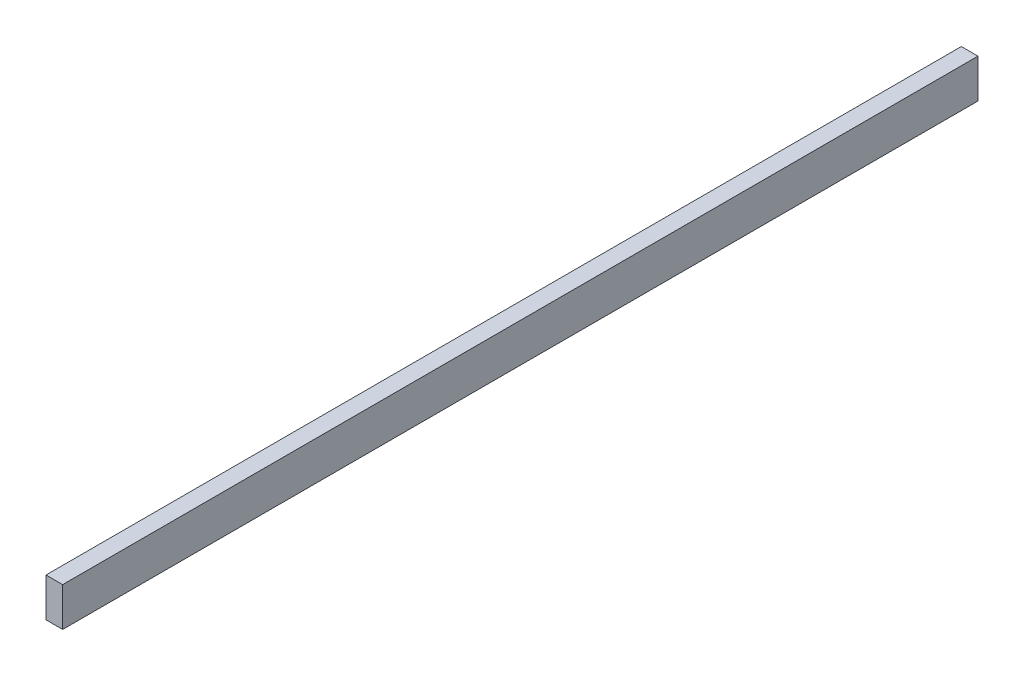
ISO-10303-21;
HEADER;
FILE_DESCRIPTION(('STEP AP214'),'2;1');
FILE_NAME('part.step','',(''),(''),'','','');
FILE_SCHEMA(('AUTOMOTIVE_DESIGN { 1 0 10303 214 1 1 1 1 }'));
ENDSEC;
DATA;
#1=APPLICATION_CONTEXT('core data for automotive mechanical design processes');
#2=APPLICATION_PROTOCOL_DEFINITION('international standard','automotive_design',2000,#1);
#3=PRODUCT_CONTEXT('',#1,'mechanical');
#4=PRODUCT('Part','Part','',(#3));
#5=PRODUCT_RELATED_PRODUCT_CATEGORY('part','',(#4));
#6=PRODUCT_DEFINITION_FORMATION('','',#4);
#7=PRODUCT_DEFINITION_CONTEXT('part definition',#1,'design');
#8=PRODUCT_DEFINITION('design','',#6,#7);
#9=PRODUCT_DEFINITION_SHAPE('','',#8);
#10=(LENGTH_UNIT() NAMED_UNIT(*) SI_UNIT(.MILLI.,.METRE.));
#11=(NAMED_UNIT(*) PLANE_ANGLE_UNIT() SI_UNIT($,.RADIAN.));
#12=(NAMED_UNIT(*) SI_UNIT($,.STERADIAN.) SOLID_ANGLE_UNIT());
#13=UNCERTAINTY_MEASURE_WITH_UNIT(LENGTH_MEASURE(1.E-05),#10,'distance_accuracy_value','');
#14=(GEOMETRIC_REPRESENTATION_CONTEXT(3) GLOBAL_UNCERTAINTY_ASSIGNED_CONTEXT((#13)) GLOBAL_UNIT_ASSIGNED_CONTEXT((#10,
#11,#12)) REPRESENTATION_CONTEXT('',''));
#15=CARTESIAN_POINT('',(0.,0.,0.));
#16=DIRECTION('',(0.,0.,1.));
#17=DIRECTION('',(1.,0.,0.));
#18=AXIS2_PLACEMENT_3D('',#15,#16,#17);
#19=CARTESIAN_POINT('',(0.,0.,2093.9125));
#20=DIRECTION('',(1.,0.,0.));
#21=DIRECTION('',(0.,0.,-1.));
#22=AXIS2_PLACEMENT_3D('',#19,#20,#21);
#23=PLANE('',#22);
#24=DIRECTION('',(0.,-1.,0.));
#25=VECTOR('',#24,1.);
#26=CARTESIAN_POINT('',(0.,0.,0.));
#27=LINE('',#26,#25);
#28=CARTESIAN_POINT('',(0.,88.9,0.));
#29=VERTEX_POINT('',#28);
#30=CARTESIAN_POINT('',(0.,0.,0.));
#31=VERTEX_POINT('',#30);
#32=EDGE_CURVE('E96',#29,#31,#27,.T.);
#33=ORIENTED_EDGE('',*,*,#32,.T.);
#34=DIRECTION('',(0.,0.,-1.));
#35=VECTOR('',#34,1.);
#36=CARTESIAN_POINT('',(0.,0.,2093.9125));
#37=LINE('',#36,#35);
#38=CARTESIAN_POINT('',(0.,0.,2093.9125));
#39=VERTEX_POINT('',#38);
#40=EDGE_CURVE('E11',#39,#31,#37,.T.);
#41=ORIENTED_EDGE('',*,*,#40,.F.);
#42=DIRECTION('',(0.,-1.,0.));
#43=VECTOR('',#42,1.);
#44=CARTESIAN_POINT('',(0.,0.,2093.9125));
#45=LINE('',#44,#43);
#46=CARTESIAN_POINT('',(0.,88.9,2093.9125));
#47=VERTEX_POINT('',#46);
#48=EDGE_CURVE('E84',#47,#39,#45,.T.);
#49=ORIENTED_EDGE('',*,*,#48,.F.);
#50=DIRECTION('',(0.,0.,-1.));
#51=VECTOR('',#50,1.);
#52=CARTESIAN_POINT('',(0.,88.9,2093.9125));
#53=LINE('',#52,#51);
#54=EDGE_CURVE('E92',#47,#29,#53,.T.);
#55=ORIENTED_EDGE('',*,*,#54,.T.);
#56=EDGE_LOOP('',(#33,#41,#49,#55));
#57=FACE_BOUND('',#56,.T.);
#58=ADVANCED_FACE('F33',(#57),#23,.F.);
#59=CARTESIAN_POINT('',(0.,0.,2093.9125));
#60=DIRECTION('',(0.,1.,0.));
#61=DIRECTION('',(0.,0.,1.));
#62=AXIS2_PLACEMENT_3D('',#59,#60,#61);
#63=PLANE('',#62);
#64=DIRECTION('',(1.,0.,0.));
#65=VECTOR('',#64,1.);
#66=CARTESIAN_POINT('',(0.,0.,0.));
#67=LINE('',#66,#65);
#68=CARTESIAN_POINT('',(38.1,0.,0.));
#69=VERTEX_POINT('',#68);
#70=EDGE_CURVE('E88',#31,#69,#67,.T.);
#71=ORIENTED_EDGE('',*,*,#70,.T.);
#72=DIRECTION('',(0.,0.,-1.));
#73=VECTOR('',#72,1.);
#74=CARTESIAN_POINT('',(38.1,0.,2093.9125));
#75=LINE('',#74,#73);
#76=CARTESIAN_POINT('',(38.1,0.,2093.9125));
#77=VERTEX_POINT('',#76);
#78=EDGE_CURVE('E41',#77,#69,#75,.T.);
#79=ORIENTED_EDGE('',*,*,#78,.F.);
#80=DIRECTION('',(1.,0.,0.));
#81=VECTOR('',#80,1.);
#82=CARTESIAN_POINT('',(0.,0.,2093.9125));
#83=LINE('',#82,#81);
#84=EDGE_CURVE('E79',#39,#77,#83,.T.);
#85=ORIENTED_EDGE('',*,*,#84,.F.);
#86=ORIENTED_EDGE('',*,*,#40,.T.);
#87=EDGE_LOOP('',(#71,#79,#85,#86));
#88=FACE_BOUND('',#87,.T.);
#89=ADVANCED_FACE('F87',(#88),#63,.F.);
#90=CARTESIAN_POINT('',(38.1,0.,2093.9125));
#91=DIRECTION('',(-1.,0.,0.));
#92=DIRECTION('',(0.,0.,1.));
#93=AXIS2_PLACEMENT_3D('',#90,#91,#92);
#94=PLANE('',#93);
#95=DIRECTION('',(0.,1.,0.));
#96=VECTOR('',#95,1.);
#97=CARTESIAN_POINT('',(38.1,0.,0.));
#98=LINE('',#97,#96);
#99=CARTESIAN_POINT('',(38.1,88.9,0.));
#100=VERTEX_POINT('',#99);
#101=EDGE_CURVE('E66',#69,#100,#98,.T.);
#102=ORIENTED_EDGE('',*,*,#101,.T.);
#103=DIRECTION('',(0.,0.,-1.));
#104=VECTOR('',#103,1.);
#105=CARTESIAN_POINT('',(38.1,88.9,2093.9125));
#106=LINE('',#105,#104);
#107=CARTESIAN_POINT('',(38.1,88.9,2093.9125));
#108=VERTEX_POINT('',#107);
#109=EDGE_CURVE('E89',#108,#100,#106,.T.);
#110=ORIENTED_EDGE('',*,*,#109,.F.);
#111=DIRECTION('',(0.,1.,0.));
#112=VECTOR('',#111,1.);
#113=CARTESIAN_POINT('',(38.1,0.,2093.9125));
#114=LINE('',#113,#112);
#115=EDGE_CURVE('E82',#77,#108,#114,.T.);
#116=ORIENTED_EDGE('',*,*,#115,.F.);
#117=ORIENTED_EDGE('',*,*,#78,.T.);
#118=EDGE_LOOP('',(#102,#110,#116,#117));
#119=FACE_BOUND('',#118,.T.);
#120=ADVANCED_FACE('F90',(#119),#94,.F.);
#121=CARTESIAN_POINT('',(0.,88.9,2093.9125));
#122=DIRECTION('',(0.,-1.,0.));
#123=DIRECTION('',(0.,0.,-1.));
#124=AXIS2_PLACEMENT_3D('',#121,#122,#123);
#125=PLANE('',#124);
#126=DIRECTION('',(-1.,0.,0.));
#127=VECTOR('',#126,1.);
#128=CARTESIAN_POINT('',(0.,88.9,0.));
#129=LINE('',#128,#127);
#130=EDGE_CURVE('E72',#100,#29,#129,.T.);
#131=ORIENTED_EDGE('',*,*,#130,.T.);
#132=ORIENTED_EDGE('',*,*,#54,.F.);
#133=DIRECTION('',(-1.,0.,0.));
#134=VECTOR('',#133,1.);
#135=CARTESIAN_POINT('',(0.,88.9,2093.9125));
#136=LINE('',#135,#134);
#137=EDGE_CURVE('E49',#108,#47,#136,.T.);
#138=ORIENTED_EDGE('',*,*,#137,.F.);
#139=ORIENTED_EDGE('',*,*,#109,.T.);
#140=EDGE_LOOP('',(#131,#132,#138,#139));
#141=FACE_BOUND('',#140,.T.);
#142=ADVANCED_FACE('F103',(#141),#125,.F.);
#143=CARTESIAN_POINT('',(0.,0.,2093.9125));
#144=DIRECTION('',(0.,0.,-1.));
#145=DIRECTION('',(-1.,0.,0.));
#146=AXIS2_PLACEMENT_3D('',#143,#144,#145);
#147=PLANE('',#146);
#148=ORIENTED_EDGE('',*,*,#48,.T.);
#149=ORIENTED_EDGE('',*,*,#84,.T.);
#150=ORIENTED_EDGE('',*,*,#115,.T.);
#151=ORIENTED_EDGE('',*,*,#137,.T.);
#152=EDGE_LOOP('',(#148,#149,#150,#151));
#153=FACE_BOUND('',#152,.T.);
#154=ADVANCED_FACE('F80',(#153),#147,.F.);
#155=CARTESIAN_POINT('',(0.,0.,0.));
#156=DIRECTION('',(0.,0.,-1.));
#157=DIRECTION('',(-1.,0.,0.));
#158=AXIS2_PLACEMENT_3D('',#155,#156,#157);
#159=PLANE('',#158);
#160=ORIENTED_EDGE('',*,*,#32,.F.);
#161=ORIENTED_EDGE('',*,*,#130,.F.);
#162=ORIENTED_EDGE('',*,*,#101,.F.);
#163=ORIENTED_EDGE('',*,*,#70,.F.);
#164=EDGE_LOOP('',(#160,#161,#162,#163));
#165=FACE_BOUND('',#164,.T.);
#166=ADVANCED_FACE('F106',(#165),#159,.T.);
#167=CLOSED_SHELL('',(#58,#89,#120,#142,#154,#166));
#168=MANIFOLD_SOLID_BREP('B2',#167);
#169=ADVANCED_BREP_SHAPE_REPRESENTATION('',(#18,#168),#14);
#170=SHAPE_DEFINITION_REPRESENTATION(#9,#169);
ENDSEC;
END-ISO-10303-21;
